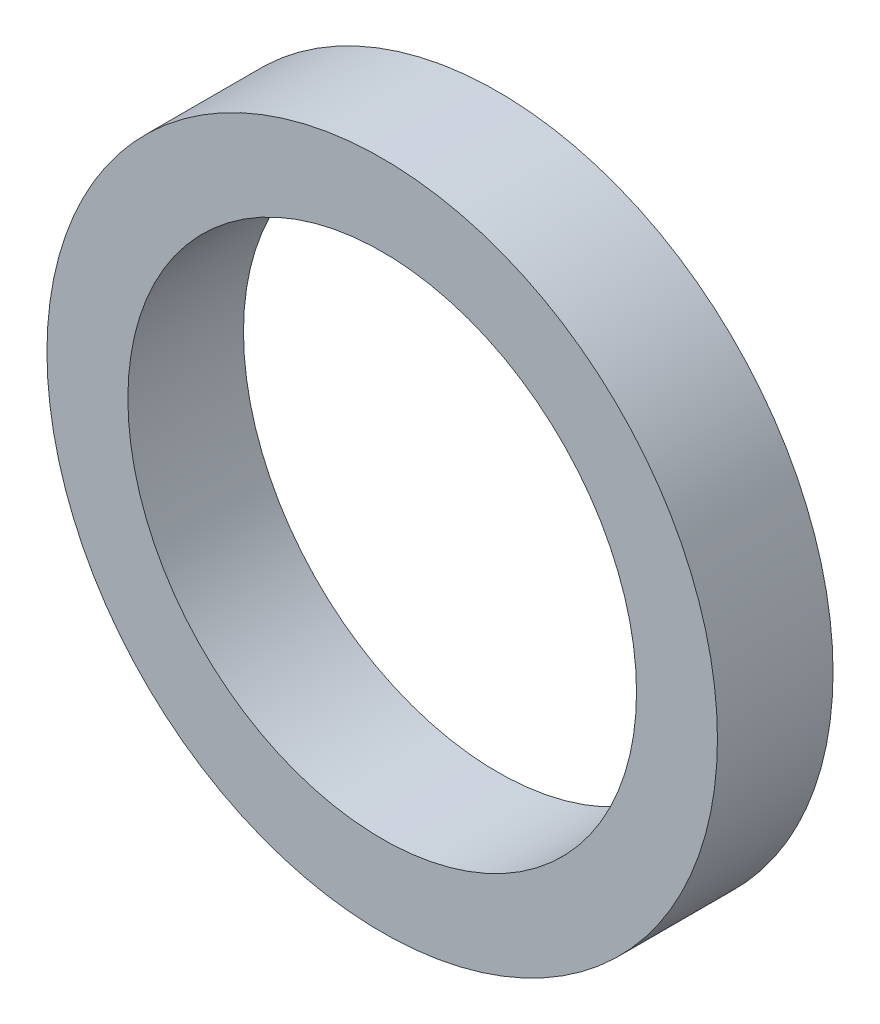
ISO-10303-21;
HEADER;
FILE_DESCRIPTION(('STEP AP214'),'2;1');
FILE_NAME('part.step','',(''),(''),'','','');
FILE_SCHEMA(('AUTOMOTIVE_DESIGN { 1 0 10303 214 1 1 1 1 }'));
ENDSEC;
DATA;
#1=APPLICATION_CONTEXT('core data for automotive mechanical design processes');
#2=APPLICATION_PROTOCOL_DEFINITION('international standard','automotive_design',2000,#1);
#3=PRODUCT_CONTEXT('',#1,'mechanical');
#4=PRODUCT('Part','Part','',(#3));
#5=PRODUCT_RELATED_PRODUCT_CATEGORY('part','',(#4));
#6=PRODUCT_DEFINITION_FORMATION('','',#4);
#7=PRODUCT_DEFINITION_CONTEXT('part definition',#1,'design');
#8=PRODUCT_DEFINITION('design','',#6,#7);
#9=PRODUCT_DEFINITION_SHAPE('','',#8);
#10=(LENGTH_UNIT() NAMED_UNIT(*) SI_UNIT(.MILLI.,.METRE.));
#11=(NAMED_UNIT(*) PLANE_ANGLE_UNIT() SI_UNIT($,.RADIAN.));
#12=(NAMED_UNIT(*) SI_UNIT($,.STERADIAN.) SOLID_ANGLE_UNIT());
#13=UNCERTAINTY_MEASURE_WITH_UNIT(LENGTH_MEASURE(1.E-05),#10,'distance_accuracy_value','');
#14=(GEOMETRIC_REPRESENTATION_CONTEXT(3) GLOBAL_UNCERTAINTY_ASSIGNED_CONTEXT((#13)) GLOBAL_UNIT_ASSIGNED_CONTEXT((#10,
#11,#12)) REPRESENTATION_CONTEXT('',''));
#15=CARTESIAN_POINT('',(0.,0.,0.));
#16=DIRECTION('',(0.,0.,1.));
#17=DIRECTION('',(1.,0.,0.));
#18=AXIS2_PLACEMENT_3D('',#15,#16,#17);
#19=CARTESIAN_POINT('',(0.,0.,25.));
#20=DIRECTION('',(0.,0.,1.));
#21=DIRECTION('',(1.,0.,0.));
#22=AXIS2_PLACEMENT_3D('',#19,#20,#21);
#23=PLANE('',#22);
#24=CARTESIAN_POINT('',(0.,0.,25.));
#25=DIRECTION('',(0.,0.,1.));
#26=DIRECTION('',(1.,0.,0.));
#27=AXIS2_PLACEMENT_3D('',#24,#25,#26);
#28=CIRCLE('',#27,72.5);
#29=CARTESIAN_POINT('',(72.5,0.,25.));
#30=VERTEX_POINT('',#29);
#31=EDGE_CURVE('E10',#30,#30,#28,.T.);
#32=ORIENTED_EDGE('',*,*,#31,.T.);
#33=EDGE_LOOP('',(#32));
#34=FACE_BOUND('',#33,.T.);
#35=CARTESIAN_POINT('',(0.,0.,25.));
#36=DIRECTION('',(0.,0.,1.));
#37=DIRECTION('',(1.,0.,0.));
#38=AXIS2_PLACEMENT_3D('',#35,#36,#37);
#39=CIRCLE('',#38,55.);
#40=CARTESIAN_POINT('',(55.,0.,25.));
#41=VERTEX_POINT('',#40);
#42=EDGE_CURVE('E42',#41,#41,#39,.T.);
#43=ORIENTED_EDGE('',*,*,#42,.F.);
#44=EDGE_LOOP('',(#43));
#45=FACE_BOUND('',#44,.T.);
#46=ADVANCED_FACE('F31',(#34,#45),#23,.T.);
#47=CARTESIAN_POINT('',(0.,0.,0.));
#48=DIRECTION('',(0.,0.,1.));
#49=DIRECTION('',(1.,0.,0.));
#50=AXIS2_PLACEMENT_3D('',#47,#48,#49);
#51=PLANE('',#50);
#52=CARTESIAN_POINT('',(0.,0.,0.));
#53=DIRECTION('',(0.,0.,1.));
#54=DIRECTION('',(1.,0.,0.));
#55=AXIS2_PLACEMENT_3D('',#52,#53,#54);
#56=CIRCLE('',#55,72.5);
#57=CARTESIAN_POINT('',(72.5,0.,0.));
#58=VERTEX_POINT('',#57);
#59=EDGE_CURVE('E35',#58,#58,#56,.T.);
#60=ORIENTED_EDGE('',*,*,#59,.F.);
#61=EDGE_LOOP('',(#60));
#62=FACE_BOUND('',#61,.T.);
#63=CARTESIAN_POINT('',(0.,0.,0.));
#64=DIRECTION('',(0.,0.,1.));
#65=DIRECTION('',(1.,0.,0.));
#66=AXIS2_PLACEMENT_3D('',#63,#64,#65);
#67=CIRCLE('',#66,55.);
#68=CARTESIAN_POINT('',(55.,0.,0.));
#69=VERTEX_POINT('',#68);
#70=EDGE_CURVE('E44',#69,#69,#67,.T.);
#71=ORIENTED_EDGE('',*,*,#70,.T.);
#72=EDGE_LOOP('',(#71));
#73=FACE_BOUND('',#72,.T.);
#74=ADVANCED_FACE('F54',(#62,#73),#51,.F.);
#75=CARTESIAN_POINT('',(0.,0.,25.));
#76=DIRECTION('',(0.,0.,-1.));
#77=DIRECTION('',(-1.,0.,0.));
#78=AXIS2_PLACEMENT_3D('',#75,#76,#77);
#79=CYLINDRICAL_SURFACE('',#78,72.5);
#80=ORIENTED_EDGE('',*,*,#31,.F.);
#81=EDGE_LOOP('',(#80));
#82=FACE_BOUND('',#81,.T.);
#83=ORIENTED_EDGE('',*,*,#59,.T.);
#84=EDGE_LOOP('',(#83));
#85=FACE_BOUND('',#84,.T.);
#86=ADVANCED_FACE('F33',(#82,#85),#79,.T.);
#87=CARTESIAN_POINT('',(0.,0.,25.));
#88=DIRECTION('',(0.,0.,-1.));
#89=DIRECTION('',(-1.,0.,0.));
#90=AXIS2_PLACEMENT_3D('',#87,#88,#89);
#91=CYLINDRICAL_SURFACE('',#90,55.);
#92=ORIENTED_EDGE('',*,*,#42,.T.);
#93=EDGE_LOOP('',(#92));
#94=FACE_BOUND('',#93,.T.);
#95=ORIENTED_EDGE('',*,*,#70,.F.);
#96=EDGE_LOOP('',(#95));
#97=FACE_BOUND('',#96,.T.);
#98=ADVANCED_FACE('F50',(#94,#97),#91,.F.);
#99=CLOSED_SHELL('',(#46,#74,#86,#98));
#100=MANIFOLD_SOLID_BREP('B2',#99);
#101=ADVANCED_BREP_SHAPE_REPRESENTATION('',(#18,#100),#14);
#102=SHAPE_DEFINITION_REPRESENTATION(#9,#101);
ENDSEC;
END-ISO-10303-21;
